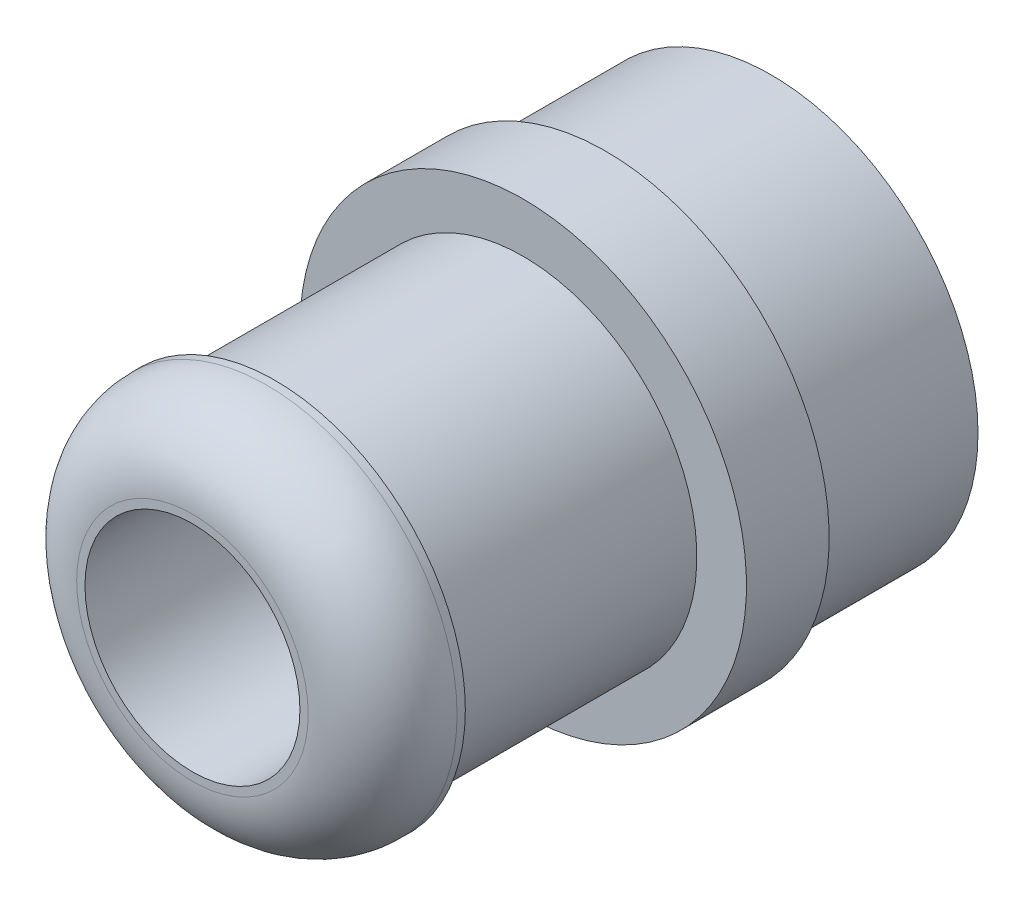
ISO-10303-21;
HEADER;
FILE_DESCRIPTION(('STEP AP214'),'2;1');
FILE_NAME('part.step','',(''),(''),'','','');
FILE_SCHEMA(('AUTOMOTIVE_DESIGN { 1 0 10303 214 1 1 1 1 }'));
ENDSEC;
DATA;
#1=APPLICATION_CONTEXT('core data for automotive mechanical design processes');
#2=APPLICATION_PROTOCOL_DEFINITION('international standard','automotive_design',2000,#1);
#3=PRODUCT_CONTEXT('',#1,'mechanical');
#4=PRODUCT('Part','Part','',(#3));
#5=PRODUCT_RELATED_PRODUCT_CATEGORY('part','',(#4));
#6=PRODUCT_DEFINITION_FORMATION('','',#4);
#7=PRODUCT_DEFINITION_CONTEXT('part definition',#1,'design');
#8=PRODUCT_DEFINITION('design','',#6,#7);
#9=PRODUCT_DEFINITION_SHAPE('','',#8);
#10=(LENGTH_UNIT() NAMED_UNIT(*) SI_UNIT(.MILLI.,.METRE.));
#11=(NAMED_UNIT(*) PLANE_ANGLE_UNIT() SI_UNIT($,.RADIAN.));
#12=(NAMED_UNIT(*) SI_UNIT($,.STERADIAN.) SOLID_ANGLE_UNIT());
#13=UNCERTAINTY_MEASURE_WITH_UNIT(LENGTH_MEASURE(1.E-05),#10,'distance_accuracy_value','');
#14=(GEOMETRIC_REPRESENTATION_CONTEXT(3) GLOBAL_UNCERTAINTY_ASSIGNED_CONTEXT((#13)) GLOBAL_UNIT_ASSIGNED_CONTEXT((#10,
#11,#12)) REPRESENTATION_CONTEXT('',''));
#15=CARTESIAN_POINT('',(0.,0.,0.));
#16=DIRECTION('',(0.,0.,1.));
#17=DIRECTION('',(1.,0.,0.));
#18=AXIS2_PLACEMENT_3D('',#15,#16,#17);
#19=CARTESIAN_POINT('',(0.,0.,7.));
#20=DIRECTION('',(0.,0.,-1.));
#21=DIRECTION('',(-1.,0.,0.));
#22=AXIS2_PLACEMENT_3D('',#19,#20,#21);
#23=CYLINDRICAL_SURFACE('',#22,2.1);
#24=CARTESIAN_POINT('',(0.,0.,3.));
#25=DIRECTION('',(0.,0.,-1.));
#26=DIRECTION('',(-1.,0.,0.));
#27=AXIS2_PLACEMENT_3D('',#24,#25,#26);
#28=CIRCLE('',#27,2.1);
#29=CARTESIAN_POINT('',(-2.1,0.,3.));
#30=VERTEX_POINT('',#29);
#31=EDGE_CURVE('E61',#30,#30,#28,.T.);
#32=ORIENTED_EDGE('',*,*,#31,.F.);
#33=EDGE_LOOP('',(#32));
#34=FACE_BOUND('',#33,.T.);
#35=CARTESIAN_POINT('',(0.,0.,6.));
#36=DIRECTION('',(0.,0.,1.));
#37=DIRECTION('',(1.,0.,0.));
#38=AXIS2_PLACEMENT_3D('',#35,#36,#37);
#39=CIRCLE('',#38,2.1);
#40=CARTESIAN_POINT('',(2.1,0.,6.));
#41=VERTEX_POINT('',#40);
#42=EDGE_CURVE('E55',#41,#41,#39,.T.);
#43=ORIENTED_EDGE('',*,*,#42,.F.);
#44=EDGE_LOOP('',(#43));
#45=FACE_BOUND('',#44,.T.);
#46=ADVANCED_FACE('F37',(#34,#45),#23,.T.);
#47=CARTESIAN_POINT('',(0.,0.,7.));
#48=DIRECTION('',(0.,0.,1.));
#49=DIRECTION('',(1.,0.,0.));
#50=AXIS2_PLACEMENT_3D('',#47,#48,#49);
#51=PLANE('',#50);
#52=CARTESIAN_POINT('',(0.,0.,7.));
#53=DIRECTION('',(0.,0.,1.));
#54=DIRECTION('',(1.,0.,0.));
#55=AXIS2_PLACEMENT_3D('',#52,#53,#54);
#56=CIRCLE('',#55,1.4);
#57=CARTESIAN_POINT('',(1.4,0.,7.));
#58=VERTEX_POINT('',#57);
#59=EDGE_CURVE('E45',#58,#58,#56,.T.);
#60=ORIENTED_EDGE('',*,*,#59,.T.);
#61=EDGE_LOOP('',(#60));
#62=FACE_BOUND('',#61,.T.);
#63=CARTESIAN_POINT('',(0.,0.,7.));
#64=DIRECTION('',(0.,0.,1.));
#65=DIRECTION('',(1.,0.,0.));
#66=AXIS2_PLACEMENT_3D('',#63,#64,#65);
#67=CIRCLE('',#66,1.3);
#68=CARTESIAN_POINT('',(1.3,0.,7.));
#69=VERTEX_POINT('',#68);
#70=EDGE_CURVE('E65',#69,#69,#67,.T.);
#71=ORIENTED_EDGE('',*,*,#70,.F.);
#72=EDGE_LOOP('',(#71));
#73=FACE_BOUND('',#72,.T.);
#74=ADVANCED_FACE('F108',(#62,#73),#51,.T.);
#75=CARTESIAN_POINT('',(0.,0.,0.));
#76=DIRECTION('',(0.,0.,1.));
#77=DIRECTION('',(1.,0.,0.));
#78=AXIS2_PLACEMENT_3D('',#75,#76,#77);
#79=PLANE('',#78);
#80=CARTESIAN_POINT('',(0.,0.,0.));
#81=DIRECTION('',(0.,0.,1.));
#82=DIRECTION('',(1.,0.,0.));
#83=AXIS2_PLACEMENT_3D('',#80,#81,#82);
#84=CIRCLE('',#83,1.3);
#85=CARTESIAN_POINT('',(1.3,0.,0.));
#86=VERTEX_POINT('',#85);
#87=EDGE_CURVE('E66',#86,#86,#84,.T.);
#88=ORIENTED_EDGE('',*,*,#87,.T.);
#89=EDGE_LOOP('',(#88));
#90=FACE_BOUND('',#89,.T.);
#91=CARTESIAN_POINT('',(0.,0.,0.));
#92=DIRECTION('',(0.,0.,-1.));
#93=DIRECTION('',(-1.,0.,0.));
#94=AXIS2_PLACEMENT_3D('',#91,#92,#93);
#95=CIRCLE('',#94,2.5);
#96=CARTESIAN_POINT('',(-2.5,0.,0.));
#97=VERTEX_POINT('',#96);
#98=EDGE_CURVE('E70',#97,#97,#95,.T.);
#99=ORIENTED_EDGE('',*,*,#98,.T.);
#100=EDGE_LOOP('',(#99));
#101=FACE_BOUND('',#100,.T.);
#102=ADVANCED_FACE('F113',(#90,#101),#79,.F.);
#103=CARTESIAN_POINT('',(0.,0.,7.));
#104=DIRECTION('',(0.,0.,-1.));
#105=DIRECTION('',(-1.,0.,0.));
#106=AXIS2_PLACEMENT_3D('',#103,#104,#105);
#107=CYLINDRICAL_SURFACE('',#106,1.3);
#108=ORIENTED_EDGE('',*,*,#70,.T.);
#109=EDGE_LOOP('',(#108));
#110=FACE_BOUND('',#109,.T.);
#111=ORIENTED_EDGE('',*,*,#87,.F.);
#112=EDGE_LOOP('',(#111));
#113=FACE_BOUND('',#112,.T.);
#114=ADVANCED_FACE('F119',(#110,#113),#107,.F.);
#115=CARTESIAN_POINT('',(0.,0.,3.));
#116=DIRECTION('',(0.,0.,-1.));
#117=DIRECTION('',(-1.,0.,0.));
#118=AXIS2_PLACEMENT_3D('',#115,#116,#117);
#119=CYLINDRICAL_SURFACE('',#118,2.5);
#120=CARTESIAN_POINT('',(0.,0.,2.));
#121=DIRECTION('',(0.,0.,-1.));
#122=DIRECTION('',(-1.,0.,0.));
#123=AXIS2_PLACEMENT_3D('',#120,#121,#122);
#124=CIRCLE('',#123,2.5);
#125=CARTESIAN_POINT('',(-2.5,0.,2.));
#126=VERTEX_POINT('',#125);
#127=EDGE_CURVE('E50',#126,#126,#124,.F.);
#128=ORIENTED_EDGE('',*,*,#127,.F.);
#129=EDGE_LOOP('',(#128));
#130=FACE_BOUND('',#129,.T.);
#131=ORIENTED_EDGE('',*,*,#98,.F.);
#132=EDGE_LOOP('',(#131));
#133=FACE_BOUND('',#132,.T.);
#134=ADVANCED_FACE('F124',(#130,#133),#119,.T.);
#135=CARTESIAN_POINT('',(0.,0.,3.));
#136=DIRECTION('',(0.,0.,-1.));
#137=DIRECTION('',(-1.,0.,0.));
#138=AXIS2_PLACEMENT_3D('',#135,#136,#137);
#139=PLANE('',#138);
#140=ORIENTED_EDGE('',*,*,#31,.T.);
#141=EDGE_LOOP('',(#140));
#142=FACE_BOUND('',#141,.T.);
#143=CARTESIAN_POINT('',(0.,0.,3.));
#144=DIRECTION('',(0.,0.,-1.));
#145=DIRECTION('',(-1.,0.,0.));
#146=AXIS2_PLACEMENT_3D('',#143,#144,#145);
#147=CIRCLE('',#146,2.7);
#148=CARTESIAN_POINT('',(-2.7,0.,3.));
#149=VERTEX_POINT('',#148);
#150=EDGE_CURVE('E81',#149,#149,#147,.F.);
#151=ORIENTED_EDGE('',*,*,#150,.T.);
#152=EDGE_LOOP('',(#151));
#153=FACE_BOUND('',#152,.T.);
#154=ADVANCED_FACE('F90',(#142,#153),#139,.F.);
#155=CARTESIAN_POINT('',(0.,0.,6.));
#156=DIRECTION('',(0.,0.,1.));
#157=DIRECTION('',(1.,0.,0.));
#158=AXIS2_PLACEMENT_3D('',#155,#156,#157);
#159=CYLINDRICAL_SURFACE('',#158,2.3);
#160=CARTESIAN_POINT('',(0.,0.,6.1));
#161=DIRECTION('',(0.,0.,1.));
#162=DIRECTION('',(1.,0.,0.));
#163=AXIS2_PLACEMENT_3D('',#160,#161,#162);
#164=CIRCLE('',#163,2.3);
#165=CARTESIAN_POINT('',(2.3,0.,6.1));
#166=VERTEX_POINT('',#165);
#167=EDGE_CURVE('E10',#166,#166,#164,.F.);
#168=ORIENTED_EDGE('',*,*,#167,.T.);
#169=EDGE_LOOP('',(#168));
#170=FACE_BOUND('',#169,.T.);
#171=CARTESIAN_POINT('',(0.,0.,6.));
#172=DIRECTION('',(0.,0.,1.));
#173=DIRECTION('',(1.,0.,0.));
#174=AXIS2_PLACEMENT_3D('',#171,#172,#173);
#175=CIRCLE('',#174,2.3);
#176=CARTESIAN_POINT('',(2.3,0.,6.));
#177=VERTEX_POINT('',#176);
#178=EDGE_CURVE('E77',#177,#177,#175,.T.);
#179=ORIENTED_EDGE('',*,*,#178,.T.);
#180=EDGE_LOOP('',(#179));
#181=FACE_BOUND('',#180,.T.);
#182=ADVANCED_FACE('F131',(#170,#181),#159,.T.);
#183=CARTESIAN_POINT('',(0.,0.,6.));
#184=DIRECTION('',(0.,0.,1.));
#185=DIRECTION('',(1.,0.,0.));
#186=AXIS2_PLACEMENT_3D('',#183,#184,#185);
#187=PLANE('',#186);
#188=ORIENTED_EDGE('',*,*,#42,.T.);
#189=EDGE_LOOP('',(#188));
#190=FACE_BOUND('',#189,.T.);
#191=ORIENTED_EDGE('',*,*,#178,.F.);
#192=EDGE_LOOP('',(#191));
#193=FACE_BOUND('',#192,.T.);
#194=ADVANCED_FACE('F96',(#190,#193),#187,.F.);
#195=CARTESIAN_POINT('',(0.,0.,10.6367532368147));
#196=DIRECTION('',(0.,0.,-1.));
#197=DIRECTION('',(-1.,0.,0.));
#198=AXIS2_PLACEMENT_3D('',#195,#196,#197);
#199=CYLINDRICAL_SURFACE('',#198,2.7);
#200=ORIENTED_EDGE('',*,*,#150,.F.);
#201=EDGE_LOOP('',(#200));
#202=FACE_BOUND('',#201,.T.);
#203=CARTESIAN_POINT('',(0.,0.,2.));
#204=DIRECTION('',(0.,0.,-1.));
#205=DIRECTION('',(-1.,0.,0.));
#206=AXIS2_PLACEMENT_3D('',#203,#204,#205);
#207=CIRCLE('',#206,2.7);
#208=CARTESIAN_POINT('',(-2.7,0.,2.));
#209=VERTEX_POINT('',#208);
#210=EDGE_CURVE('E82',#209,#209,#207,.T.);
#211=ORIENTED_EDGE('',*,*,#210,.F.);
#212=EDGE_LOOP('',(#211));
#213=FACE_BOUND('',#212,.T.);
#214=ADVANCED_FACE('F92',(#202,#213),#199,.T.);
#215=CARTESIAN_POINT('',(0.,0.,2.));
#216=DIRECTION('',(0.,0.,-1.));
#217=DIRECTION('',(-1.,0.,0.));
#218=AXIS2_PLACEMENT_3D('',#215,#216,#217);
#219=PLANE('',#218);
#220=ORIENTED_EDGE('',*,*,#127,.T.);
#221=EDGE_LOOP('',(#220));
#222=FACE_BOUND('',#221,.T.);
#223=ORIENTED_EDGE('',*,*,#210,.T.);
#224=EDGE_LOOP('',(#223));
#225=FACE_BOUND('',#224,.T.);
#226=ADVANCED_FACE('F95',(#222,#225),#219,.T.);
#227=CARTESIAN_POINT('',(0.,0.,6.1));
#228=DIRECTION('',(0.,0.,1.));
#229=DIRECTION('',(1.,0.,0.));
#230=AXIS2_PLACEMENT_3D('',#227,#228,#229);
#231=TOROIDAL_SURFACE('',#230,1.4,0.9);
#232=ORIENTED_EDGE('',*,*,#167,.F.);
#233=EDGE_LOOP('',(#232));
#234=FACE_BOUND('',#233,.T.);
#235=ORIENTED_EDGE('',*,*,#59,.F.);
#236=EDGE_LOOP('',(#235));
#237=FACE_BOUND('',#236,.T.);
#238=ADVANCED_FACE('F39',(#234,#237),#231,.T.);
#239=CLOSED_SHELL('',(#46,#74,#102,#114,#134,#154,#182,#194,#214,#226,#238));
#240=MANIFOLD_SOLID_BREP('B2',#239);
#241=ADVANCED_BREP_SHAPE_REPRESENTATION('',(#18,#240),#14);
#242=SHAPE_DEFINITION_REPRESENTATION(#9,#241);
ENDSEC;
END-ISO-10303-21;
